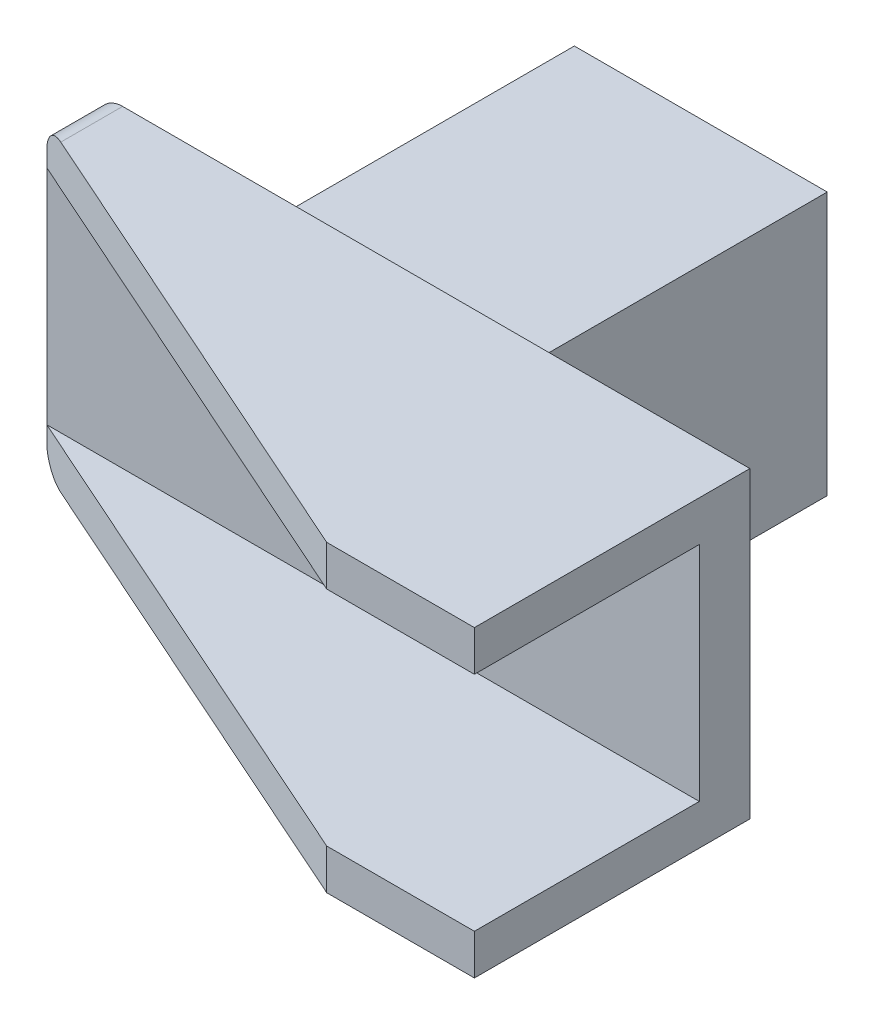
ISO-10303-21;
HEADER;
FILE_DESCRIPTION(('STEP AP214'),'2;1');
FILE_NAME('part.step','',(''),(''),'','','');
FILE_SCHEMA(('AUTOMOTIVE_DESIGN { 1 0 10303 214 1 1 1 1 }'));
ENDSEC;
DATA;
#1=APPLICATION_CONTEXT('core data for automotive mechanical design processes');
#2=APPLICATION_PROTOCOL_DEFINITION('international standard','automotive_design',2000,#1);
#3=PRODUCT_CONTEXT('',#1,'mechanical');
#4=PRODUCT('Part','Part','',(#3));
#5=PRODUCT_RELATED_PRODUCT_CATEGORY('part','',(#4));
#6=PRODUCT_DEFINITION_FORMATION('','',#4);
#7=PRODUCT_DEFINITION_CONTEXT('part definition',#1,'design');
#8=PRODUCT_DEFINITION('design','',#6,#7);
#9=PRODUCT_DEFINITION_SHAPE('','',#8);
#10=(LENGTH_UNIT() NAMED_UNIT(*) SI_UNIT(.MILLI.,.METRE.));
#11=(NAMED_UNIT(*) PLANE_ANGLE_UNIT() SI_UNIT($,.RADIAN.));
#12=(NAMED_UNIT(*) SI_UNIT($,.STERADIAN.) SOLID_ANGLE_UNIT());
#13=UNCERTAINTY_MEASURE_WITH_UNIT(LENGTH_MEASURE(1.E-05),#10,'distance_accuracy_value','');
#14=(GEOMETRIC_REPRESENTATION_CONTEXT(3) GLOBAL_UNCERTAINTY_ASSIGNED_CONTEXT((#13)) GLOBAL_UNIT_ASSIGNED_CONTEXT((#10,
#11,#12)) REPRESENTATION_CONTEXT('',''));
#15=CARTESIAN_POINT('',(0.,0.,0.));
#16=DIRECTION('',(0.,0.,1.));
#17=DIRECTION('',(1.,0.,0.));
#18=AXIS2_PLACEMENT_3D('',#15,#16,#17);
#19=CARTESIAN_POINT('',(144.586036565936,53.7864015562166,22.4522105914857));
#20=DIRECTION('',(0.,1.,0.));
#21=DIRECTION('',(1.,0.,0.));
#22=AXIS2_PLACEMENT_3D('',#19,#20,#21);
#23=PLANE('',#22);
#24=DIRECTION('',(0.,0.,1.));
#25=VECTOR('',#24,1.);
#26=CARTESIAN_POINT('',(137.241970265516,53.7864015562166,22.4522105914857));
#27=LINE('',#26,#25);
#28=CARTESIAN_POINT('',(137.241970265516,53.7864015562166,22.4522105914857));
#29=VERTEX_POINT('',#28);
#30=CARTESIAN_POINT('',(137.241970265516,53.7864015562166,26.8989300854986));
#31=VERTEX_POINT('',#30);
#32=EDGE_CURVE('E189',#29,#31,#27,.T.);
#33=ORIENTED_EDGE('',*,*,#32,.F.);
#34=DIRECTION('',(-1.,0.,0.));
#35=VECTOR('',#34,1.);
#36=CARTESIAN_POINT('',(138.441970265516,53.7864015562166,22.4522105914858));
#37=LINE('',#36,#35);
#38=CARTESIAN_POINT('',(124.340095260788,53.7864015562166,22.4522105914858));
#39=VERTEX_POINT('',#38);
#40=EDGE_CURVE('E195',#29,#39,#37,.T.);
#41=ORIENTED_EDGE('',*,*,#40,.T.);
#42=DIRECTION('',(-0.913468780010777,0.,-0.406908820186565));
#43=VECTOR('',#42,1.);
#44=CARTESIAN_POINT('',(134.322526777958,53.7864015562166,26.898930085497));
#45=LINE('',#44,#43);
#46=CARTESIAN_POINT('',(134.322526777958,53.7864015562166,26.898930085497));
#47=VERTEX_POINT('',#46);
#48=EDGE_CURVE('E191',#47,#39,#45,.T.);
#49=ORIENTED_EDGE('',*,*,#48,.F.);
#50=DIRECTION('',(-1.,0.,2.19918537741854E-13));
#51=VECTOR('',#50,1.);
#52=CARTESIAN_POINT('',(138.441970265516,53.7864015562166,26.8989300854961));
#53=LINE('',#52,#51);
#54=EDGE_CURVE('E194',#31,#47,#53,.T.);
#55=ORIENTED_EDGE('',*,*,#54,.F.);
#56=EDGE_LOOP('',(#33,#41,#49,#55));
#57=FACE_BOUND('',#56,.T.);
#58=ADVANCED_FACE('F40',(#57),#23,.T.);
#59=CARTESIAN_POINT('',(144.586036565936,58.1864015562166,22.4522105914857));
#60=DIRECTION('',(0.,0.,1.));
#61=DIRECTION('',(1.,0.,0.));
#62=AXIS2_PLACEMENT_3D('',#59,#60,#61);
#63=PLANE('',#62);
#64=DIRECTION('',(0.,-1.,0.));
#65=VECTOR('',#64,1.);
#66=CARTESIAN_POINT('',(137.241970265516,58.1864015562166,22.4522105914857));
#67=LINE('',#66,#65);
#68=CARTESIAN_POINT('',(137.241970265516,58.1864015562166,22.4522105914858));
#69=VERTEX_POINT('',#68);
#70=EDGE_CURVE('E187',#69,#29,#67,.T.);
#71=ORIENTED_EDGE('',*,*,#70,.F.);
#72=DIRECTION('',(-1.,0.,0.));
#73=VECTOR('',#72,1.);
#74=CARTESIAN_POINT('',(138.441970265516,58.1864015562166,22.4522105914858));
#75=LINE('',#74,#73);
#76=CARTESIAN_POINT('',(124.340095260788,58.1864015562166,22.4522105914858));
#77=VERTEX_POINT('',#76);
#78=EDGE_CURVE('E245',#69,#77,#75,.T.);
#79=ORIENTED_EDGE('',*,*,#78,.T.);
#80=DIRECTION('',(0.,1.,0.));
#81=VECTOR('',#80,1.);
#82=CARTESIAN_POINT('',(124.340095260788,53.7864015562166,22.4522105914858));
#83=LINE('',#82,#81);
#84=EDGE_CURVE('E43',#39,#77,#83,.T.);
#85=ORIENTED_EDGE('',*,*,#84,.F.);
#86=ORIENTED_EDGE('',*,*,#40,.F.);
#87=EDGE_LOOP('',(#71,#79,#85,#86));
#88=FACE_BOUND('',#87,.T.);
#89=ADVANCED_FACE('F280',(#88),#63,.T.);
#90=CARTESIAN_POINT('',(144.586036565936,58.1864015562166,26.8989300854958));
#91=DIRECTION('',(0.,-1.,0.));
#92=DIRECTION('',(0.,0.,-1.));
#93=AXIS2_PLACEMENT_3D('',#90,#91,#92);
#94=PLANE('',#93);
#95=DIRECTION('',(0.,0.,-1.));
#96=VECTOR('',#95,1.);
#97=CARTESIAN_POINT('',(137.241970265516,58.1864015562166,26.8989300854958));
#98=LINE('',#97,#96);
#99=CARTESIAN_POINT('',(137.241970265516,58.1864015562166,26.8989300854986));
#100=VERTEX_POINT('',#99);
#101=EDGE_CURVE('E183',#100,#69,#98,.T.);
#102=ORIENTED_EDGE('',*,*,#101,.F.);
#103=DIRECTION('',(1.,0.,-1.09959268870932E-13));
#104=VECTOR('',#103,1.);
#105=CARTESIAN_POINT('',(134.322526777958,58.1864015562166,26.8989300854964));
#106=LINE('',#105,#104);
#107=CARTESIAN_POINT('',(134.322526777958,58.1864015562166,26.8989300854964));
#108=VERTEX_POINT('',#107);
#109=EDGE_CURVE('E218',#108,#100,#106,.T.);
#110=ORIENTED_EDGE('',*,*,#109,.F.);
#111=DIRECTION('',(0.913468780010804,0.,0.406908820186503));
#112=VECTOR('',#111,1.);
#113=CARTESIAN_POINT('',(124.340095260788,58.1864015562166,22.4522105914858));
#114=LINE('',#113,#112);
#115=EDGE_CURVE('E221',#77,#108,#114,.T.);
#116=ORIENTED_EDGE('',*,*,#115,.F.);
#117=ORIENTED_EDGE('',*,*,#78,.F.);
#118=EDGE_LOOP('',(#102,#110,#116,#117));
#119=FACE_BOUND('',#118,.T.);
#120=ADVANCED_FACE('F263',(#119),#94,.T.);
#121=CARTESIAN_POINT('',(134.322526777957,53.7864015562166,26.8989300854976));
#122=DIRECTION('',(-0.406908820186585,0.,0.913468780010768));
#123=DIRECTION('',(0.,1.,0.));
#124=AXIS2_PLACEMENT_3D('',#121,#122,#123);
#125=PLANE('',#124);
#126=CARTESIAN_POINT('',(124.840095260788,53.4864015562165,22.6749378642134));
#127=DIRECTION('',(0.406908820186585,0.,-0.913468780010768));
#128=DIRECTION('',(-0.913468780010768,0.,-0.406908820186585));
#129=AXIS2_PLACEMENT_3D('',#126,#127,#128);
#130=ELLIPSE('',#129,0.547364081774098,0.499999999999905);
#131=CARTESIAN_POINT('',(124.840095260788,52.9864015562166,22.6749378642153));
#132=VERTEX_POINT('',#131);
#133=CARTESIAN_POINT('',(124.340095260788,53.4864015562166,22.4522105914858));
#134=VERTEX_POINT('',#133);
#135=EDGE_CURVE('E11',#132,#134,#130,.T.);
#136=ORIENTED_EDGE('',*,*,#135,.F.);
#137=DIRECTION('',(0.9134687800108,0.,0.406908820186514));
#138=VECTOR('',#137,1.);
#139=CARTESIAN_POINT('',(124.840095260788,52.9864015562166,22.6749378642153));
#140=LINE('',#139,#138);
#141=CARTESIAN_POINT('',(134.322526777957,52.9864015562166,26.8989300854983));
#142=VERTEX_POINT('',#141);
#143=EDGE_CURVE('E203',#132,#142,#140,.T.);
#144=ORIENTED_EDGE('',*,*,#143,.T.);
#145=DIRECTION('',(7.54951656745114E-13,1.,-1.68753899743026E-12));
#146=VECTOR('',#145,1.);
#147=CARTESIAN_POINT('',(134.322526777957,52.9864015562166,26.8989300854983));
#148=LINE('',#147,#146);
#149=EDGE_CURVE('E204',#142,#47,#148,.T.);
#150=ORIENTED_EDGE('',*,*,#149,.T.);
#151=ORIENTED_EDGE('',*,*,#48,.T.);
#152=DIRECTION('',(7.69754630406769E-13,1.,0.));
#153=VECTOR('',#152,1.);
#154=CARTESIAN_POINT('',(124.340095260788,53.4864015562166,22.4522105914858));
#155=LINE('',#154,#153);
#156=EDGE_CURVE('E48',#134,#39,#155,.T.);
#157=ORIENTED_EDGE('',*,*,#156,.F.);
#158=EDGE_LOOP('',(#136,#144,#150,#151,#157));
#159=FACE_BOUND('',#158,.T.);
#160=ADVANCED_FACE('F293',(#159),#125,.T.);
#161=CARTESIAN_POINT('',(144.586036565936,53.7864015562166,26.8989300854958));
#162=DIRECTION('',(0.,3.62123525610159E-12,1.));
#163=DIRECTION('',(0.,-1.,3.62123525610159E-12));
#164=AXIS2_PLACEMENT_3D('',#161,#162,#163);
#165=PLANE('',#164);
#166=DIRECTION('',(0.,-1.,0.));
#167=VECTOR('',#166,1.);
#168=CARTESIAN_POINT('',(137.241970265516,58.9864015562166,26.8989300854986));
#169=LINE('',#168,#167);
#170=CARTESIAN_POINT('',(137.241970265516,52.9864015562166,26.8989300854985));
#171=VERTEX_POINT('',#170);
#172=EDGE_CURVE('E179',#31,#171,#169,.T.);
#173=ORIENTED_EDGE('',*,*,#172,.F.);
#174=ORIENTED_EDGE('',*,*,#54,.T.);
#175=ORIENTED_EDGE('',*,*,#149,.F.);
#176=DIRECTION('',(-1.,0.,0.));
#177=VECTOR('',#176,1.);
#178=CARTESIAN_POINT('',(138.441970265516,52.9864015562166,26.8989300854986));
#179=LINE('',#178,#177);
#180=EDGE_CURVE('E201',#171,#142,#179,.T.);
#181=ORIENTED_EDGE('',*,*,#180,.F.);
#182=EDGE_LOOP('',(#173,#174,#175,#181));
#183=FACE_BOUND('',#182,.T.);
#184=ADVANCED_FACE('F290',(#183),#165,.T.);
#185=CARTESIAN_POINT('',(124.340095260788,58.4864015562166,22.4522105914858));
#186=DIRECTION('',(-1.,0.,0.));
#187=DIRECTION('',(0.,1.,0.));
#188=AXIS2_PLACEMENT_3D('',#185,#186,#187);
#189=PLANE('',#188);
#190=DIRECTION('',(0.,-1.,0.));
#191=VECTOR('',#190,1.);
#192=CARTESIAN_POINT('',(124.340095260788,58.4864015562166,21.4522105914858));
#193=LINE('',#192,#191);
#194=CARTESIAN_POINT('',(124.340095260788,58.4864015562166,21.4522105914858));
#195=VERTEX_POINT('',#194);
#196=CARTESIAN_POINT('',(124.340095260788,53.4864015562166,21.4522105914858));
#197=VERTEX_POINT('',#196);
#198=EDGE_CURVE('E209',#195,#197,#193,.T.);
#199=ORIENTED_EDGE('',*,*,#198,.T.);
#200=DIRECTION('',(0.,0.,1.));
#201=VECTOR('',#200,1.);
#202=CARTESIAN_POINT('',(124.340095260788,53.4864015562166,21.4522105914858));
#203=LINE('',#202,#201);
#204=EDGE_CURVE('E232',#197,#134,#203,.T.);
#205=ORIENTED_EDGE('',*,*,#204,.T.);
#206=ORIENTED_EDGE('',*,*,#156,.T.);
#207=ORIENTED_EDGE('',*,*,#84,.T.);
#208=DIRECTION('',(0.,1.,0.));
#209=VECTOR('',#208,1.);
#210=CARTESIAN_POINT('',(124.340095260788,58.1864015562166,22.4522105914858));
#211=LINE('',#210,#209);
#212=CARTESIAN_POINT('',(124.340095260788,58.4864015562166,22.4522105914858));
#213=VERTEX_POINT('',#212);
#214=EDGE_CURVE('E213',#77,#213,#211,.T.);
#215=ORIENTED_EDGE('',*,*,#214,.T.);
#216=DIRECTION('',(0.,0.,1.));
#217=VECTOR('',#216,1.);
#218=CARTESIAN_POINT('',(124.340095260788,58.4864015562166,21.4522105914858));
#219=LINE('',#218,#217);
#220=EDGE_CURVE('E234',#195,#213,#219,.T.);
#221=ORIENTED_EDGE('',*,*,#220,.F.);
#222=EDGE_LOOP('',(#199,#205,#206,#207,#215,#221));
#223=FACE_BOUND('',#222,.T.);
#224=ADVANCED_FACE('F274',(#223),#189,.T.);
#225=CARTESIAN_POINT('',(124.840095260788,53.4864015562165,22.6749378642153));
#226=DIRECTION('',(0.,0.,1.));
#227=DIRECTION('',(-0.707106781186539,-0.707106781186556,0.));
#228=AXIS2_PLACEMENT_3D('',#225,#226,#227);
#229=CYLINDRICAL_SURFACE('',#228,0.499999999999905);
#230=ORIENTED_EDGE('',*,*,#204,.F.);
#231=CARTESIAN_POINT('',(124.840095260788,53.4864015562166,21.4522105914858));
#232=DIRECTION('',(0.,0.,1.));
#233=DIRECTION('',(0.,-1.,0.));
#234=AXIS2_PLACEMENT_3D('',#231,#232,#233);
#235=CIRCLE('',#234,0.500000000000007);
#236=CARTESIAN_POINT('',(124.840095260788,52.9864015562166,21.4522105914858));
#237=VERTEX_POINT('',#236);
#238=EDGE_CURVE('E238',#197,#237,#235,.T.);
#239=ORIENTED_EDGE('',*,*,#238,.T.);
#240=DIRECTION('',(1.74333905427811E-13,0.,1.));
#241=VECTOR('',#240,1.);
#242=CARTESIAN_POINT('',(124.840095260788,52.9864015562166,21.4522105914858));
#243=LINE('',#242,#241);
#244=EDGE_CURVE('E200',#237,#132,#243,.T.);
#245=ORIENTED_EDGE('',*,*,#244,.T.);
#246=ORIENTED_EDGE('',*,*,#135,.T.);
#247=EDGE_LOOP('',(#230,#239,#245,#246));
#248=FACE_BOUND('',#247,.T.);
#249=ADVANCED_FACE('F306',(#248),#229,.T.);
#250=CARTESIAN_POINT('',(144.586036565936,58.9864015562166,26.8989300854958));
#251=DIRECTION('',(0.,0.,1.));
#252=DIRECTION('',(1.,0.,0.));
#253=AXIS2_PLACEMENT_3D('',#250,#251,#252);
#254=PLANE('',#253);
#255=CARTESIAN_POINT('',(137.241970265516,58.9864015562166,26.8989300854986));
#256=VERTEX_POINT('',#255);
#257=EDGE_CURVE('E184',#256,#100,#169,.T.);
#258=ORIENTED_EDGE('',*,*,#257,.F.);
#259=DIRECTION('',(-1.,0.,0.));
#260=VECTOR('',#259,1.);
#261=CARTESIAN_POINT('',(138.441970265516,58.9864015562166,26.8989300854958));
#262=LINE('',#261,#260);
#263=CARTESIAN_POINT('',(134.322526777958,58.9864015562166,26.8989300854958));
#264=VERTEX_POINT('',#263);
#265=EDGE_CURVE('E227',#256,#264,#262,.T.);
#266=ORIENTED_EDGE('',*,*,#265,.T.);
#267=DIRECTION('',(3.5527136788005E-13,1.,-7.4940054162198E-13));
#268=VECTOR('',#267,1.);
#269=CARTESIAN_POINT('',(134.322526777958,58.1864015562166,26.8989300854964));
#270=LINE('',#269,#268);
#271=EDGE_CURVE('E217',#108,#264,#270,.T.);
#272=ORIENTED_EDGE('',*,*,#271,.F.);
#273=ORIENTED_EDGE('',*,*,#109,.T.);
#274=EDGE_LOOP('',(#258,#266,#272,#273));
#275=FACE_BOUND('',#274,.T.);
#276=ADVANCED_FACE('F266',(#275),#254,.T.);
#277=CARTESIAN_POINT('',(134.322526777957,58.9864015562166,26.8989300854976));
#278=DIRECTION('',(-0.406908820186585,0.,0.913468780010768));
#279=DIRECTION('',(0.,1.,0.));
#280=AXIS2_PLACEMENT_3D('',#277,#278,#279);
#281=PLANE('',#280);
#282=ORIENTED_EDGE('',*,*,#214,.F.);
#283=ORIENTED_EDGE('',*,*,#115,.T.);
#284=ORIENTED_EDGE('',*,*,#271,.T.);
#285=DIRECTION('',(-0.913468780010883,0.,-0.406908820186328));
#286=VECTOR('',#285,1.);
#287=CARTESIAN_POINT('',(134.322526777958,58.9864015562166,26.8989300854958));
#288=LINE('',#287,#286);
#289=CARTESIAN_POINT('',(124.840095260788,58.9864015562166,22.6749378642146));
#290=VERTEX_POINT('',#289);
#291=EDGE_CURVE('E199',#264,#290,#288,.T.);
#292=ORIENTED_EDGE('',*,*,#291,.T.);
#293=CARTESIAN_POINT('',(124.840095260788,58.4864015562167,22.6749378642134));
#294=DIRECTION('',(0.406908820186585,0.,-0.913468780010768));
#295=DIRECTION('',(-0.913468780010768,0.,-0.406908820186585));
#296=AXIS2_PLACEMENT_3D('',#293,#294,#295);
#297=ELLIPSE('',#296,0.547364081774083,0.499999999999886);
#298=EDGE_CURVE('E216',#213,#290,#297,.T.);
#299=ORIENTED_EDGE('',*,*,#298,.F.);
#300=EDGE_LOOP('',(#282,#283,#284,#292,#299));
#301=FACE_BOUND('',#300,.T.);
#302=ADVANCED_FACE('F256',(#301),#281,.T.);
#303=CARTESIAN_POINT('',(124.840095260788,58.4864015562167,21.4522105914858));
#304=DIRECTION('',(0.,0.,-1.));
#305=DIRECTION('',(-0.707106781186565,0.70710678118653,0.));
#306=AXIS2_PLACEMENT_3D('',#303,#304,#305);
#307=CYLINDRICAL_SURFACE('',#306,0.499999999999886);
#308=ORIENTED_EDGE('',*,*,#220,.T.);
#309=ORIENTED_EDGE('',*,*,#298,.T.);
#310=DIRECTION('',(-2.17917381784891E-13,0.,-1.));
#311=VECTOR('',#310,1.);
#312=CARTESIAN_POINT('',(124.840095260788,58.9864015562166,22.6749378642146));
#313=LINE('',#312,#311);
#314=CARTESIAN_POINT('',(124.840095260788,58.9864015562166,21.4522105914858));
#315=VERTEX_POINT('',#314);
#316=EDGE_CURVE('E196',#290,#315,#313,.T.);
#317=ORIENTED_EDGE('',*,*,#316,.T.);
#318=CARTESIAN_POINT('',(124.840095260788,58.4864015562166,21.4522105914858));
#319=DIRECTION('',(0.,0.,1.));
#320=DIRECTION('',(-1.,0.,0.));
#321=AXIS2_PLACEMENT_3D('',#318,#319,#320);
#322=CIRCLE('',#321,0.499999999999989);
#323=EDGE_CURVE('E205',#315,#195,#322,.T.);
#324=ORIENTED_EDGE('',*,*,#323,.T.);
#325=EDGE_LOOP('',(#308,#309,#317,#324));
#326=FACE_BOUND('',#325,.T.);
#327=ADVANCED_FACE('F302',(#326),#307,.T.);
#328=CARTESIAN_POINT('',(144.586036565936,58.9864015562166,21.4522105914858));
#329=DIRECTION('',(0.,1.,0.));
#330=DIRECTION('',(1.,0.,0.));
#331=AXIS2_PLACEMENT_3D('',#328,#329,#330);
#332=PLANE('',#331);
#333=DIRECTION('',(0.,0.,-1.));
#334=VECTOR('',#333,1.);
#335=CARTESIAN_POINT('',(137.241970265516,58.9864015562166,26.8989300854986));
#336=LINE('',#335,#334);
#337=CARTESIAN_POINT('',(137.241970265516,58.9864015562166,21.4522105914858));
#338=VERTEX_POINT('',#337);
#339=EDGE_CURVE('E172',#256,#338,#336,.T.);
#340=ORIENTED_EDGE('',*,*,#339,.T.);
#341=DIRECTION('',(-1.,0.,0.));
#342=VECTOR('',#341,1.);
#343=CARTESIAN_POINT('',(136.66873749405,58.9864015562166,21.4522105914858));
#344=LINE('',#343,#342);
#345=EDGE_CURVE('E208',#338,#315,#344,.T.);
#346=ORIENTED_EDGE('',*,*,#345,.T.);
#347=ORIENTED_EDGE('',*,*,#316,.F.);
#348=ORIENTED_EDGE('',*,*,#291,.F.);
#349=ORIENTED_EDGE('',*,*,#265,.F.);
#350=EDGE_LOOP('',(#340,#346,#347,#348,#349));
#351=FACE_BOUND('',#350,.T.);
#352=ADVANCED_FACE('F269',(#351),#332,.T.);
#353=CARTESIAN_POINT('',(144.586036565936,52.9864015562166,21.4522105914858));
#354=DIRECTION('',(0.,0.,-1.));
#355=DIRECTION('',(-1.,0.,0.));
#356=AXIS2_PLACEMENT_3D('',#353,#354,#355);
#357=PLANE('',#356);
#358=DIRECTION('',(0.,1.,0.));
#359=VECTOR('',#358,1.);
#360=CARTESIAN_POINT('',(127.471428400083,58.1864015562166,21.4522105914858));
#361=LINE('',#360,#359);
#362=CARTESIAN_POINT('',(127.471428400083,52.9864015562166,21.4522105914858));
#363=VERTEX_POINT('',#362);
#364=CARTESIAN_POINT('',(127.471428400083,58.1864015562166,21.4522105914858));
#365=VERTEX_POINT('',#364);
#366=EDGE_CURVE('E168',#363,#365,#361,.T.);
#367=ORIENTED_EDGE('',*,*,#366,.F.);
#368=DIRECTION('',(1.,0.,0.));
#369=VECTOR('',#368,1.);
#370=CARTESIAN_POINT('',(124.840095260788,52.9864015562166,21.4522105914858));
#371=LINE('',#370,#369);
#372=EDGE_CURVE('E241',#237,#363,#371,.T.);
#373=ORIENTED_EDGE('',*,*,#372,.F.);
#374=ORIENTED_EDGE('',*,*,#238,.F.);
#375=ORIENTED_EDGE('',*,*,#198,.F.);
#376=ORIENTED_EDGE('',*,*,#323,.F.);
#377=ORIENTED_EDGE('',*,*,#345,.F.);
#378=DIRECTION('',(0.,-1.,0.));
#379=VECTOR('',#378,1.);
#380=CARTESIAN_POINT('',(137.241970265516,58.9864015562166,21.4522105914858));
#381=LINE('',#380,#379);
#382=CARTESIAN_POINT('',(137.241970265516,52.9864015562166,21.4522105914858));
#383=VERTEX_POINT('',#382);
#384=EDGE_CURVE('E181',#338,#383,#381,.T.);
#385=ORIENTED_EDGE('',*,*,#384,.T.);
#386=CARTESIAN_POINT('',(132.471428400083,52.9864015562166,21.4522105914858));
#387=VERTEX_POINT('',#386);
#388=EDGE_CURVE('E62',#387,#383,#371,.T.);
#389=ORIENTED_EDGE('',*,*,#388,.F.);
#390=DIRECTION('',(0.,-1.,0.));
#391=VECTOR('',#390,1.);
#392=CARTESIAN_POINT('',(132.471428400083,58.1864015562166,21.4522105914858));
#393=LINE('',#392,#391);
#394=CARTESIAN_POINT('',(132.471428400083,58.1864015562166,21.4522105914858));
#395=VERTEX_POINT('',#394);
#396=EDGE_CURVE('E165',#395,#387,#393,.T.);
#397=ORIENTED_EDGE('',*,*,#396,.F.);
#398=DIRECTION('',(1.,0.,0.));
#399=VECTOR('',#398,1.);
#400=CARTESIAN_POINT('',(127.471428400083,58.1864015562166,21.4522105914858));
#401=LINE('',#400,#399);
#402=EDGE_CURVE('E56',#365,#395,#401,.T.);
#403=ORIENTED_EDGE('',*,*,#402,.F.);
#404=EDGE_LOOP('',(#367,#373,#374,#375,#376,#377,#385,#389,#397,#403));
#405=FACE_BOUND('',#404,.T.);
#406=ADVANCED_FACE('F299',(#405),#357,.T.);
#407=CARTESIAN_POINT('',(144.586036565936,52.9864015562166,26.8989300854987));
#408=DIRECTION('',(0.,-1.,0.));
#409=DIRECTION('',(0.,0.,-1.));
#410=AXIS2_PLACEMENT_3D('',#407,#408,#409);
#411=PLANE('',#410);
#412=DIRECTION('',(0.,0.,-1.));
#413=VECTOR('',#412,1.);
#414=CARTESIAN_POINT('',(137.241970265516,52.9864015562166,26.8989300854986));
#415=LINE('',#414,#413);
#416=EDGE_CURVE('E169',#171,#383,#415,.T.);
#417=ORIENTED_EDGE('',*,*,#416,.F.);
#418=ORIENTED_EDGE('',*,*,#180,.T.);
#419=ORIENTED_EDGE('',*,*,#143,.F.);
#420=ORIENTED_EDGE('',*,*,#244,.F.);
#421=ORIENTED_EDGE('',*,*,#372,.T.);
#422=DIRECTION('',(0.,0.,1.));
#423=VECTOR('',#422,1.);
#424=CARTESIAN_POINT('',(127.471428400083,52.9864015562166,15.1522105914858));
#425=LINE('',#424,#423);
#426=CARTESIAN_POINT('',(127.471428400083,52.9864015562166,15.1522105914858));
#427=VERTEX_POINT('',#426);
#428=EDGE_CURVE('E307',#427,#363,#425,.T.);
#429=ORIENTED_EDGE('',*,*,#428,.F.);
#430=DIRECTION('',(-1.,0.,0.));
#431=VECTOR('',#430,1.);
#432=CARTESIAN_POINT('',(127.471428400083,52.9864015562166,15.1522105914858));
#433=LINE('',#432,#431);
#434=CARTESIAN_POINT('',(132.471428400083,52.9864015562166,15.1522105914858));
#435=VERTEX_POINT('',#434);
#436=EDGE_CURVE('E161',#435,#427,#433,.T.);
#437=ORIENTED_EDGE('',*,*,#436,.F.);
#438=DIRECTION('',(0.,0.,1.));
#439=VECTOR('',#438,1.);
#440=CARTESIAN_POINT('',(132.471428400083,52.9864015562166,15.1522105914858));
#441=LINE('',#440,#439);
#442=EDGE_CURVE('E174',#435,#387,#441,.T.);
#443=ORIENTED_EDGE('',*,*,#442,.T.);
#444=ORIENTED_EDGE('',*,*,#388,.T.);
#445=EDGE_LOOP('',(#417,#418,#419,#420,#421,#429,#437,#443,#444));
#446=FACE_BOUND('',#445,.T.);
#447=ADVANCED_FACE('F297',(#446),#411,.T.);
#448=CARTESIAN_POINT('',(137.241970265516,58.9864015562166,26.8989300854986));
#449=DIRECTION('',(-1.,0.,0.));
#450=DIRECTION('',(0.,-1.,0.));
#451=AXIS2_PLACEMENT_3D('',#448,#449,#450);
#452=PLANE('',#451);
#453=ORIENTED_EDGE('',*,*,#32,.T.);
#454=ORIENTED_EDGE('',*,*,#172,.T.);
#455=ORIENTED_EDGE('',*,*,#416,.T.);
#456=ORIENTED_EDGE('',*,*,#384,.F.);
#457=ORIENTED_EDGE('',*,*,#339,.F.);
#458=ORIENTED_EDGE('',*,*,#257,.T.);
#459=ORIENTED_EDGE('',*,*,#101,.T.);
#460=ORIENTED_EDGE('',*,*,#70,.T.);
#461=EDGE_LOOP('',(#453,#454,#455,#456,#457,#458,#459,#460));
#462=FACE_BOUND('',#461,.T.);
#463=ADVANCED_FACE('F283',(#462),#452,.F.);
#464=CARTESIAN_POINT('',(127.471428400083,58.1864015562166,15.1522105914858));
#465=DIRECTION('',(1.,0.,0.));
#466=DIRECTION('',(0.,0.,-1.));
#467=AXIS2_PLACEMENT_3D('',#464,#465,#466);
#468=PLANE('',#467);
#469=ORIENTED_EDGE('',*,*,#366,.T.);
#470=DIRECTION('',(0.,0.,1.));
#471=VECTOR('',#470,1.);
#472=CARTESIAN_POINT('',(127.471428400083,58.1864015562166,15.1522105914858));
#473=LINE('',#472,#471);
#474=CARTESIAN_POINT('',(127.471428400083,58.1864015562166,15.1522105914858));
#475=VERTEX_POINT('',#474);
#476=EDGE_CURVE('E149',#475,#365,#473,.T.);
#477=ORIENTED_EDGE('',*,*,#476,.F.);
#478=DIRECTION('',(0.,1.,0.));
#479=VECTOR('',#478,1.);
#480=CARTESIAN_POINT('',(127.471428400083,58.1864015562166,15.1522105914858));
#481=LINE('',#480,#479);
#482=EDGE_CURVE('E156',#427,#475,#481,.T.);
#483=ORIENTED_EDGE('',*,*,#482,.F.);
#484=ORIENTED_EDGE('',*,*,#428,.T.);
#485=EDGE_LOOP('',(#469,#477,#483,#484));
#486=FACE_BOUND('',#485,.T.);
#487=ADVANCED_FACE('F167',(#486),#468,.F.);
#488=CARTESIAN_POINT('',(127.471428400083,58.1864015562166,15.1522105914858));
#489=DIRECTION('',(0.,-1.,0.));
#490=DIRECTION('',(0.,0.,-1.));
#491=AXIS2_PLACEMENT_3D('',#488,#489,#490);
#492=PLANE('',#491);
#493=ORIENTED_EDGE('',*,*,#402,.T.);
#494=DIRECTION('',(0.,0.,1.));
#495=VECTOR('',#494,1.);
#496=CARTESIAN_POINT('',(132.471428400083,58.1864015562166,15.1522105914858));
#497=LINE('',#496,#495);
#498=CARTESIAN_POINT('',(132.471428400083,58.1864015562166,15.1522105914858));
#499=VERTEX_POINT('',#498);
#500=EDGE_CURVE('E152',#499,#395,#497,.T.);
#501=ORIENTED_EDGE('',*,*,#500,.F.);
#502=DIRECTION('',(1.,0.,0.));
#503=VECTOR('',#502,1.);
#504=CARTESIAN_POINT('',(127.471428400083,58.1864015562166,15.1522105914858));
#505=LINE('',#504,#503);
#506=EDGE_CURVE('E145',#475,#499,#505,.T.);
#507=ORIENTED_EDGE('',*,*,#506,.F.);
#508=ORIENTED_EDGE('',*,*,#476,.T.);
#509=EDGE_LOOP('',(#493,#501,#507,#508));
#510=FACE_BOUND('',#509,.T.);
#511=ADVANCED_FACE('F147',(#510),#492,.F.);
#512=CARTESIAN_POINT('',(132.471428400083,58.1864015562166,15.1522105914858));
#513=DIRECTION('',(-1.,0.,0.));
#514=DIRECTION('',(0.,0.,1.));
#515=AXIS2_PLACEMENT_3D('',#512,#513,#514);
#516=PLANE('',#515);
#517=ORIENTED_EDGE('',*,*,#396,.T.);
#518=ORIENTED_EDGE('',*,*,#442,.F.);
#519=DIRECTION('',(0.,-1.,0.));
#520=VECTOR('',#519,1.);
#521=CARTESIAN_POINT('',(132.471428400083,58.1864015562166,15.1522105914858));
#522=LINE('',#521,#520);
#523=EDGE_CURVE('E155',#499,#435,#522,.T.);
#524=ORIENTED_EDGE('',*,*,#523,.F.);
#525=ORIENTED_EDGE('',*,*,#500,.T.);
#526=EDGE_LOOP('',(#517,#518,#524,#525));
#527=FACE_BOUND('',#526,.T.);
#528=ADVANCED_FACE('F316',(#527),#516,.F.);
#529=CARTESIAN_POINT('',(0.,0.,15.152210591486));
#530=DIRECTION('',(0.,0.,1.));
#531=DIRECTION('',(1.,0.,0.));
#532=AXIS2_PLACEMENT_3D('',#529,#530,#531);
#533=PLANE('',#532);
#534=ORIENTED_EDGE('',*,*,#482,.T.);
#535=ORIENTED_EDGE('',*,*,#506,.T.);
#536=ORIENTED_EDGE('',*,*,#523,.T.);
#537=ORIENTED_EDGE('',*,*,#436,.T.);
#538=EDGE_LOOP('',(#534,#535,#536,#537));
#539=FACE_BOUND('',#538,.T.);
#540=ADVANCED_FACE('F159',(#539),#533,.F.);
#541=CLOSED_SHELL('',(#58,#89,#120,#160,#184,#224,#249,#276,#302,#327,#352,#406,#447,#463,#487,
#511,#528,#540));
#542=MANIFOLD_SOLID_BREP('B2',#541);
#543=ADVANCED_BREP_SHAPE_REPRESENTATION('',(#18,#542),#14);
#544=SHAPE_DEFINITION_REPRESENTATION(#9,#543);
ENDSEC;
END-ISO-10303-21;
